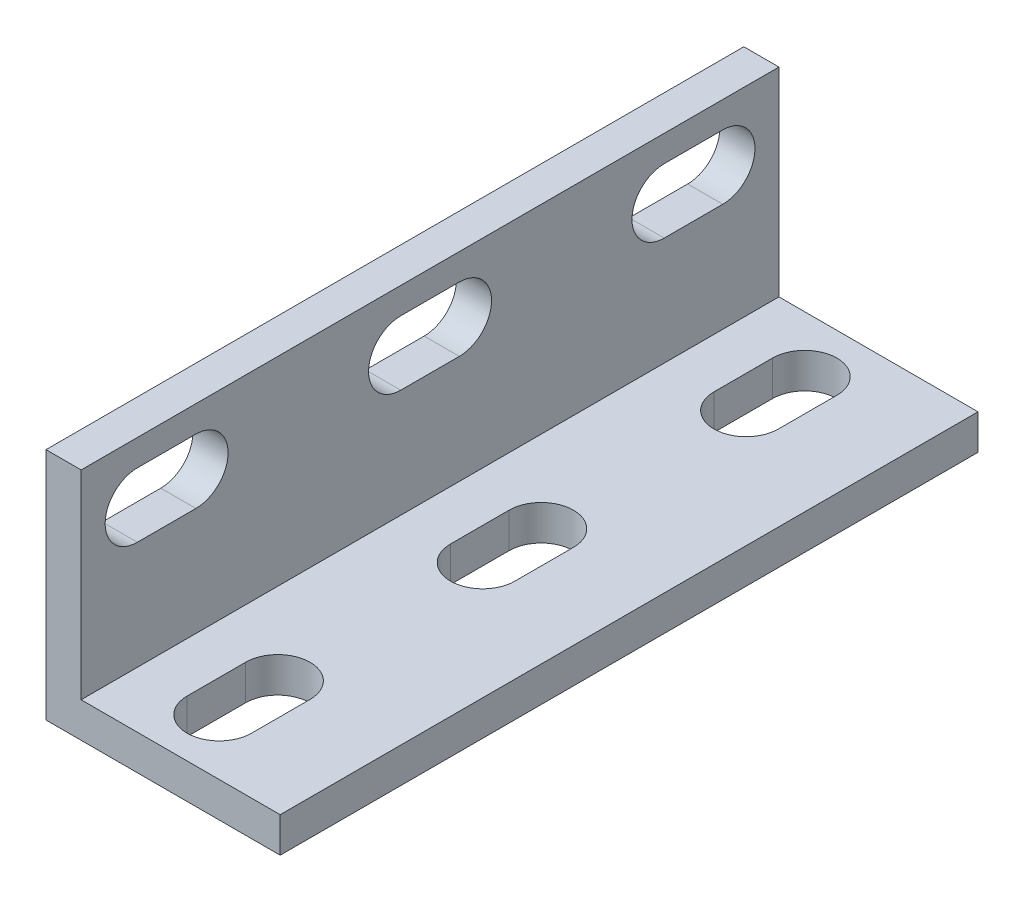
ISO-10303-21;
HEADER;
FILE_DESCRIPTION(('STEP AP214'),'2;1');
FILE_NAME('part.step','',(''),(''),'','','');
FILE_SCHEMA(('AUTOMOTIVE_DESIGN { 1 0 10303 214 1 1 1 1 }'));
ENDSEC;
DATA;
#1=APPLICATION_CONTEXT('core data for automotive mechanical design processes');
#2=APPLICATION_PROTOCOL_DEFINITION('international standard','automotive_design',2000,#1);
#3=PRODUCT_CONTEXT('',#1,'mechanical');
#4=PRODUCT('Part','Part','',(#3));
#5=PRODUCT_RELATED_PRODUCT_CATEGORY('part','',(#4));
#6=PRODUCT_DEFINITION_FORMATION('','',#4);
#7=PRODUCT_DEFINITION_CONTEXT('part definition',#1,'design');
#8=PRODUCT_DEFINITION('design','',#6,#7);
#9=PRODUCT_DEFINITION_SHAPE('','',#8);
#10=(LENGTH_UNIT() NAMED_UNIT(*) SI_UNIT(.MILLI.,.METRE.));
#11=(NAMED_UNIT(*) PLANE_ANGLE_UNIT() SI_UNIT($,.RADIAN.));
#12=(NAMED_UNIT(*) SI_UNIT($,.STERADIAN.) SOLID_ANGLE_UNIT());
#13=UNCERTAINTY_MEASURE_WITH_UNIT(LENGTH_MEASURE(1.E-05),#10,'distance_accuracy_value','');
#14=(GEOMETRIC_REPRESENTATION_CONTEXT(3) GLOBAL_UNCERTAINTY_ASSIGNED_CONTEXT((#13)) GLOBAL_UNIT_ASSIGNED_CONTEXT((#10,
#11,#12)) REPRESENTATION_CONTEXT('',''));
#15=CARTESIAN_POINT('',(0.,0.,0.));
#16=DIRECTION('',(0.,0.,1.));
#17=DIRECTION('',(1.,0.,0.));
#18=AXIS2_PLACEMENT_3D('',#15,#16,#17);
#19=CARTESIAN_POINT('',(0.,0.,59.6));
#20=DIRECTION('',(0.,1.,0.));
#21=DIRECTION('',(0.,0.,1.));
#22=AXIS2_PLACEMENT_3D('',#19,#20,#21);
#23=PLANE('',#22);
#24=DIRECTION('',(0.,0.,-1.));
#25=VECTOR('',#24,1.);
#26=CARTESIAN_POINT('',(12.75,0.,27.3));
#27=LINE('',#26,#25);
#28=CARTESIAN_POINT('',(12.75,0.,32.3));
#29=VERTEX_POINT('',#28);
#30=CARTESIAN_POINT('',(12.75,0.,27.3));
#31=VERTEX_POINT('',#30);
#32=EDGE_CURVE('E339',#29,#31,#27,.T.);
#33=ORIENTED_EDGE('',*,*,#32,.T.);
#34=CARTESIAN_POINT('',(10.,0.,27.3));
#35=DIRECTION('',(0.,1.,0.));
#36=DIRECTION('',(0.,0.,1.));
#37=AXIS2_PLACEMENT_3D('',#34,#35,#36);
#38=CIRCLE('',#37,2.75);
#39=CARTESIAN_POINT('',(7.25,0.,27.3));
#40=VERTEX_POINT('',#39);
#41=EDGE_CURVE('E329',#31,#40,#38,.T.);
#42=ORIENTED_EDGE('',*,*,#41,.T.);
#43=DIRECTION('',(0.,0.,1.));
#44=VECTOR('',#43,1.);
#45=CARTESIAN_POINT('',(7.25,0.,27.3));
#46=LINE('',#45,#44);
#47=CARTESIAN_POINT('',(7.25,0.,32.3));
#48=VERTEX_POINT('',#47);
#49=EDGE_CURVE('E332',#40,#48,#46,.T.);
#50=ORIENTED_EDGE('',*,*,#49,.T.);
#51=CARTESIAN_POINT('',(10.,0.,32.3));
#52=DIRECTION('',(0.,1.,0.));
#53=DIRECTION('',(0.,0.,1.));
#54=AXIS2_PLACEMENT_3D('',#51,#52,#53);
#55=CIRCLE('',#54,2.75);
#56=EDGE_CURVE('E336',#48,#29,#55,.T.);
#57=ORIENTED_EDGE('',*,*,#56,.T.);
#58=EDGE_LOOP('',(#33,#42,#50,#57));
#59=FACE_BOUND('',#58,.T.);
#60=DIRECTION('',(0.,0.,1.));
#61=VECTOR('',#60,1.);
#62=CARTESIAN_POINT('',(7.25,0.,9.8));
#63=LINE('',#62,#61);
#64=CARTESIAN_POINT('',(7.25,0.,4.8));
#65=VERTEX_POINT('',#64);
#66=CARTESIAN_POINT('',(7.25,0.,9.8));
#67=VERTEX_POINT('',#66);
#68=EDGE_CURVE('E373',#65,#67,#63,.T.);
#69=ORIENTED_EDGE('',*,*,#68,.T.);
#70=CARTESIAN_POINT('',(10.,0.,9.8));
#71=DIRECTION('',(0.,1.,0.));
#72=DIRECTION('',(0.,0.,1.));
#73=AXIS2_PLACEMENT_3D('',#70,#71,#72);
#74=CIRCLE('',#73,2.75);
#75=CARTESIAN_POINT('',(12.75,0.,9.8));
#76=VERTEX_POINT('',#75);
#77=EDGE_CURVE('E363',#67,#76,#74,.T.);
#78=ORIENTED_EDGE('',*,*,#77,.T.);
#79=DIRECTION('',(0.,0.,-1.));
#80=VECTOR('',#79,1.);
#81=CARTESIAN_POINT('',(12.75,0.,9.8));
#82=LINE('',#81,#80);
#83=CARTESIAN_POINT('',(12.75,0.,4.8));
#84=VERTEX_POINT('',#83);
#85=EDGE_CURVE('E366',#76,#84,#82,.T.);
#86=ORIENTED_EDGE('',*,*,#85,.T.);
#87=CARTESIAN_POINT('',(10.,0.,4.8));
#88=DIRECTION('',(0.,1.,0.));
#89=DIRECTION('',(0.,0.,1.));
#90=AXIS2_PLACEMENT_3D('',#87,#88,#89);
#91=CIRCLE('',#90,2.75);
#92=EDGE_CURVE('E370',#84,#65,#91,.T.);
#93=ORIENTED_EDGE('',*,*,#92,.T.);
#94=EDGE_LOOP('',(#69,#78,#86,#93));
#95=FACE_BOUND('',#94,.T.);
#96=DIRECTION('',(0.,0.,1.));
#97=VECTOR('',#96,1.);
#98=CARTESIAN_POINT('',(7.25,0.,54.8));
#99=LINE('',#98,#97);
#100=CARTESIAN_POINT('',(7.25,0.,49.8));
#101=VERTEX_POINT('',#100);
#102=CARTESIAN_POINT('',(7.25,0.,54.8));
#103=VERTEX_POINT('',#102);
#104=EDGE_CURVE('E403',#101,#103,#99,.T.);
#105=ORIENTED_EDGE('',*,*,#104,.T.);
#106=CARTESIAN_POINT('',(10.,0.,54.8));
#107=DIRECTION('',(0.,1.,0.));
#108=DIRECTION('',(0.,0.,1.));
#109=AXIS2_PLACEMENT_3D('',#106,#107,#108);
#110=CIRCLE('',#109,2.75);
#111=CARTESIAN_POINT('',(12.75,0.,54.8));
#112=VERTEX_POINT('',#111);
#113=EDGE_CURVE('E393',#103,#112,#110,.T.);
#114=ORIENTED_EDGE('',*,*,#113,.T.);
#115=DIRECTION('',(0.,0.,-1.));
#116=VECTOR('',#115,1.);
#117=CARTESIAN_POINT('',(12.75,0.,54.8));
#118=LINE('',#117,#116);
#119=CARTESIAN_POINT('',(12.75,0.,49.8));
#120=VERTEX_POINT('',#119);
#121=EDGE_CURVE('E396',#112,#120,#118,.T.);
#122=ORIENTED_EDGE('',*,*,#121,.T.);
#123=CARTESIAN_POINT('',(10.,0.,49.8));
#124=DIRECTION('',(0.,1.,0.));
#125=DIRECTION('',(0.,0.,1.));
#126=AXIS2_PLACEMENT_3D('',#123,#124,#125);
#127=CIRCLE('',#126,2.75);
#128=EDGE_CURVE('E400',#120,#101,#127,.T.);
#129=ORIENTED_EDGE('',*,*,#128,.T.);
#130=EDGE_LOOP('',(#105,#114,#122,#129));
#131=FACE_BOUND('',#130,.T.);
#132=DIRECTION('',(1.,0.,0.));
#133=VECTOR('',#132,1.);
#134=CARTESIAN_POINT('',(0.,0.,0.));
#135=LINE('',#134,#133);
#136=CARTESIAN_POINT('',(0.,0.,0.));
#137=VERTEX_POINT('',#136);
#138=CARTESIAN_POINT('',(20.,0.,0.));
#139=VERTEX_POINT('',#138);
#140=EDGE_CURVE('E418',#137,#139,#135,.T.);
#141=ORIENTED_EDGE('',*,*,#140,.T.);
#142=DIRECTION('',(0.,0.,-1.));
#143=VECTOR('',#142,1.);
#144=CARTESIAN_POINT('',(20.,0.,59.6));
#145=LINE('',#144,#143);
#146=CARTESIAN_POINT('',(20.,0.,59.6));
#147=VERTEX_POINT('',#146);
#148=EDGE_CURVE('E11',#147,#139,#145,.T.);
#149=ORIENTED_EDGE('',*,*,#148,.F.);
#150=DIRECTION('',(1.,0.,0.));
#151=VECTOR('',#150,1.);
#152=CARTESIAN_POINT('',(0.,0.,59.6));
#153=LINE('',#152,#151);
#154=CARTESIAN_POINT('',(0.,0.,59.6));
#155=VERTEX_POINT('',#154);
#156=EDGE_CURVE('E425',#155,#147,#153,.T.);
#157=ORIENTED_EDGE('',*,*,#156,.F.);
#158=DIRECTION('',(0.,0.,-1.));
#159=VECTOR('',#158,1.);
#160=CARTESIAN_POINT('',(0.,0.,59.6));
#161=LINE('',#160,#159);
#162=EDGE_CURVE('E442',#155,#137,#161,.T.);
#163=ORIENTED_EDGE('',*,*,#162,.T.);
#164=EDGE_LOOP('',(#141,#149,#157,#163));
#165=FACE_BOUND('',#164,.T.);
#166=ADVANCED_FACE('F32',(#59,#95,#131,#165),#23,.F.);
#167=CARTESIAN_POINT('',(20.,3.,59.6));
#168=DIRECTION('',(1.,0.,0.));
#169=DIRECTION('',(0.,0.,-1.));
#170=AXIS2_PLACEMENT_3D('',#167,#168,#169);
#171=PLANE('',#170);
#172=DIRECTION('',(0.,-1.,0.));
#173=VECTOR('',#172,1.);
#174=CARTESIAN_POINT('',(20.,3.,0.));
#175=LINE('',#174,#173);
#176=CARTESIAN_POINT('',(20.,3.,0.));
#177=VERTEX_POINT('',#176);
#178=EDGE_CURVE('E445',#177,#139,#175,.T.);
#179=ORIENTED_EDGE('',*,*,#178,.F.);
#180=DIRECTION('',(0.,0.,-1.));
#181=VECTOR('',#180,1.);
#182=CARTESIAN_POINT('',(20.,3.,59.6));
#183=LINE('',#182,#181);
#184=CARTESIAN_POINT('',(20.,3.,59.6));
#185=VERTEX_POINT('',#184);
#186=EDGE_CURVE('E39',#185,#177,#183,.T.);
#187=ORIENTED_EDGE('',*,*,#186,.F.);
#188=DIRECTION('',(0.,-1.,0.));
#189=VECTOR('',#188,1.);
#190=CARTESIAN_POINT('',(20.,3.,59.6));
#191=LINE('',#190,#189);
#192=EDGE_CURVE('E427',#185,#147,#191,.T.);
#193=ORIENTED_EDGE('',*,*,#192,.T.);
#194=ORIENTED_EDGE('',*,*,#148,.T.);
#195=EDGE_LOOP('',(#179,#187,#193,#194));
#196=FACE_BOUND('',#195,.T.);
#197=ADVANCED_FACE('F472',(#196),#171,.T.);
#198=CARTESIAN_POINT('',(0.,3.,59.6));
#199=DIRECTION('',(0.,1.,0.));
#200=DIRECTION('',(0.,0.,1.));
#201=AXIS2_PLACEMENT_3D('',#198,#199,#200);
#202=PLANE('',#201);
#203=CARTESIAN_POINT('',(10.,3.,27.3));
#204=DIRECTION('',(0.,1.,0.));
#205=DIRECTION('',(0.,0.,1.));
#206=AXIS2_PLACEMENT_3D('',#203,#204,#205);
#207=CIRCLE('',#206,2.75);
#208=CARTESIAN_POINT('',(12.75,3.,27.3));
#209=VERTEX_POINT('',#208);
#210=CARTESIAN_POINT('',(7.25,3.,27.3));
#211=VERTEX_POINT('',#210);
#212=EDGE_CURVE('E343',#209,#211,#207,.T.);
#213=ORIENTED_EDGE('',*,*,#212,.F.);
#214=DIRECTION('',(0.,0.,-1.));
#215=VECTOR('',#214,1.);
#216=CARTESIAN_POINT('',(12.75,3.,27.3));
#217=LINE('',#216,#215);
#218=CARTESIAN_POINT('',(12.75,3.,32.3));
#219=VERTEX_POINT('',#218);
#220=EDGE_CURVE('E333',#219,#209,#217,.T.);
#221=ORIENTED_EDGE('',*,*,#220,.F.);
#222=CARTESIAN_POINT('',(10.,3.,32.3));
#223=DIRECTION('',(0.,1.,0.));
#224=DIRECTION('',(0.,0.,1.));
#225=AXIS2_PLACEMENT_3D('',#222,#223,#224);
#226=CIRCLE('',#225,2.75);
#227=CARTESIAN_POINT('',(7.25,3.,32.3));
#228=VERTEX_POINT('',#227);
#229=EDGE_CURVE('E349',#228,#219,#226,.T.);
#230=ORIENTED_EDGE('',*,*,#229,.F.);
#231=DIRECTION('',(0.,0.,1.));
#232=VECTOR('',#231,1.);
#233=CARTESIAN_POINT('',(7.25,3.,27.3));
#234=LINE('',#233,#232);
#235=EDGE_CURVE('E345',#211,#228,#234,.T.);
#236=ORIENTED_EDGE('',*,*,#235,.F.);
#237=EDGE_LOOP('',(#213,#221,#230,#236));
#238=FACE_BOUND('',#237,.T.);
#239=CARTESIAN_POINT('',(10.,3.,9.8));
#240=DIRECTION('',(0.,1.,0.));
#241=DIRECTION('',(0.,0.,1.));
#242=AXIS2_PLACEMENT_3D('',#239,#240,#241);
#243=CIRCLE('',#242,2.75);
#244=CARTESIAN_POINT('',(7.25,3.,9.8));
#245=VERTEX_POINT('',#244);
#246=CARTESIAN_POINT('',(12.75,3.,9.8));
#247=VERTEX_POINT('',#246);
#248=EDGE_CURVE('E322',#245,#247,#243,.T.);
#249=ORIENTED_EDGE('',*,*,#248,.F.);
#250=DIRECTION('',(0.,0.,1.));
#251=VECTOR('',#250,1.);
#252=CARTESIAN_POINT('',(7.25,3.,9.8));
#253=LINE('',#252,#251);
#254=CARTESIAN_POINT('',(7.25,3.,4.8));
#255=VERTEX_POINT('',#254);
#256=EDGE_CURVE('E367',#255,#245,#253,.T.);
#257=ORIENTED_EDGE('',*,*,#256,.F.);
#258=CARTESIAN_POINT('',(10.,3.,4.8));
#259=DIRECTION('',(0.,1.,0.));
#260=DIRECTION('',(0.,0.,1.));
#261=AXIS2_PLACEMENT_3D('',#258,#259,#260);
#262=CIRCLE('',#261,2.75);
#263=CARTESIAN_POINT('',(12.75,3.,4.8));
#264=VERTEX_POINT('',#263);
#265=EDGE_CURVE('E381',#264,#255,#262,.T.);
#266=ORIENTED_EDGE('',*,*,#265,.F.);
#267=DIRECTION('',(0.,0.,-1.));
#268=VECTOR('',#267,1.);
#269=CARTESIAN_POINT('',(12.75,3.,9.8));
#270=LINE('',#269,#268);
#271=EDGE_CURVE('E378',#247,#264,#270,.T.);
#272=ORIENTED_EDGE('',*,*,#271,.F.);
#273=EDGE_LOOP('',(#249,#257,#266,#272));
#274=FACE_BOUND('',#273,.T.);
#275=CARTESIAN_POINT('',(10.,3.,54.8));
#276=DIRECTION('',(0.,1.,0.));
#277=DIRECTION('',(0.,0.,1.));
#278=AXIS2_PLACEMENT_3D('',#275,#276,#277);
#279=CIRCLE('',#278,2.75);
#280=CARTESIAN_POINT('',(7.25,3.,54.8));
#281=VERTEX_POINT('',#280);
#282=CARTESIAN_POINT('',(12.75,3.,54.8));
#283=VERTEX_POINT('',#282);
#284=EDGE_CURVE('E356',#281,#283,#279,.T.);
#285=ORIENTED_EDGE('',*,*,#284,.F.);
#286=DIRECTION('',(0.,0.,1.));
#287=VECTOR('',#286,1.);
#288=CARTESIAN_POINT('',(7.25,3.,54.8));
#289=LINE('',#288,#287);
#290=CARTESIAN_POINT('',(7.25,3.,49.8));
#291=VERTEX_POINT('',#290);
#292=EDGE_CURVE('E397',#291,#281,#289,.T.);
#293=ORIENTED_EDGE('',*,*,#292,.F.);
#294=CARTESIAN_POINT('',(10.,3.,49.8));
#295=DIRECTION('',(0.,1.,0.));
#296=DIRECTION('',(0.,0.,1.));
#297=AXIS2_PLACEMENT_3D('',#294,#295,#296);
#298=CIRCLE('',#297,2.75);
#299=CARTESIAN_POINT('',(12.75,3.,49.8));
#300=VERTEX_POINT('',#299);
#301=EDGE_CURVE('E411',#300,#291,#298,.T.);
#302=ORIENTED_EDGE('',*,*,#301,.F.);
#303=DIRECTION('',(0.,0.,-1.));
#304=VECTOR('',#303,1.);
#305=CARTESIAN_POINT('',(12.75,3.,54.8));
#306=LINE('',#305,#304);
#307=EDGE_CURVE('E408',#283,#300,#306,.T.);
#308=ORIENTED_EDGE('',*,*,#307,.F.);
#309=EDGE_LOOP('',(#285,#293,#302,#308));
#310=FACE_BOUND('',#309,.T.);
#311=DIRECTION('',(1.,0.,0.));
#312=VECTOR('',#311,1.);
#313=CARTESIAN_POINT('',(0.,3.,0.));
#314=LINE('',#313,#312);
#315=CARTESIAN_POINT('',(3.,3.,0.));
#316=VERTEX_POINT('',#315);
#317=EDGE_CURVE('E448',#316,#177,#314,.T.);
#318=ORIENTED_EDGE('',*,*,#317,.F.);
#319=DIRECTION('',(0.,0.,-1.));
#320=VECTOR('',#319,1.);
#321=CARTESIAN_POINT('',(3.,3.,59.6));
#322=LINE('',#321,#320);
#323=CARTESIAN_POINT('',(3.,3.,59.6));
#324=VERTEX_POINT('',#323);
#325=EDGE_CURVE('E464',#324,#316,#322,.T.);
#326=ORIENTED_EDGE('',*,*,#325,.F.);
#327=DIRECTION('',(1.,0.,0.));
#328=VECTOR('',#327,1.);
#329=CARTESIAN_POINT('',(0.,3.,59.6));
#330=LINE('',#329,#328);
#331=EDGE_CURVE('E431',#324,#185,#330,.T.);
#332=ORIENTED_EDGE('',*,*,#331,.T.);
#333=ORIENTED_EDGE('',*,*,#186,.T.);
#334=EDGE_LOOP('',(#318,#326,#332,#333));
#335=FACE_BOUND('',#334,.T.);
#336=ADVANCED_FACE('F468',(#238,#274,#310,#335),#202,.T.);
#337=CARTESIAN_POINT('',(3.,20.,59.6));
#338=DIRECTION('',(1.,0.,0.));
#339=DIRECTION('',(0.,1.,0.));
#340=AXIS2_PLACEMENT_3D('',#337,#338,#339);
#341=PLANE('',#340);
#342=CARTESIAN_POINT('',(3.,15.,32.3));
#343=DIRECTION('',(1.,0.,0.));
#344=DIRECTION('',(0.,1.,0.));
#345=AXIS2_PLACEMENT_3D('',#342,#343,#344);
#346=CIRCLE('',#345,2.75);
#347=CARTESIAN_POINT('',(3.,17.75,32.3));
#348=VERTEX_POINT('',#347);
#349=CARTESIAN_POINT('',(3.,12.25,32.3));
#350=VERTEX_POINT('',#349);
#351=EDGE_CURVE('E46',#348,#350,#346,.T.);
#352=ORIENTED_EDGE('',*,*,#351,.F.);
#353=DIRECTION('',(0.,0.,1.));
#354=VECTOR('',#353,1.);
#355=CARTESIAN_POINT('',(3.,17.75,32.3));
#356=LINE('',#355,#354);
#357=CARTESIAN_POINT('',(3.,17.75,27.3));
#358=VERTEX_POINT('',#357);
#359=EDGE_CURVE('E248',#358,#348,#356,.T.);
#360=ORIENTED_EDGE('',*,*,#359,.F.);
#361=CARTESIAN_POINT('',(3.,15.,27.3));
#362=DIRECTION('',(1.,0.,0.));
#363=DIRECTION('',(0.,1.,0.));
#364=AXIS2_PLACEMENT_3D('',#361,#362,#363);
#365=CIRCLE('',#364,2.75);
#366=CARTESIAN_POINT('',(3.,12.25,27.3));
#367=VERTEX_POINT('',#366);
#368=EDGE_CURVE('E251',#367,#358,#365,.T.);
#369=ORIENTED_EDGE('',*,*,#368,.F.);
#370=DIRECTION('',(0.,0.,-1.));
#371=VECTOR('',#370,1.);
#372=CARTESIAN_POINT('',(3.,12.25,32.3));
#373=LINE('',#372,#371);
#374=EDGE_CURVE('E257',#350,#367,#373,.T.);
#375=ORIENTED_EDGE('',*,*,#374,.F.);
#376=EDGE_LOOP('',(#352,#360,#369,#375));
#377=FACE_BOUND('',#376,.T.);
#378=CARTESIAN_POINT('',(3.,15.,9.79999999999999));
#379=DIRECTION('',(1.,0.,0.));
#380=DIRECTION('',(0.,1.,0.));
#381=AXIS2_PLACEMENT_3D('',#378,#379,#380);
#382=CIRCLE('',#381,2.75);
#383=CARTESIAN_POINT('',(3.,17.75,9.79999999999999));
#384=VERTEX_POINT('',#383);
#385=CARTESIAN_POINT('',(3.,12.25,9.79999999999999));
#386=VERTEX_POINT('',#385);
#387=EDGE_CURVE('E54',#384,#386,#382,.T.);
#388=ORIENTED_EDGE('',*,*,#387,.F.);
#389=DIRECTION('',(0.,0.,1.));
#390=VECTOR('',#389,1.);
#391=CARTESIAN_POINT('',(3.,17.75,9.79999999999999));
#392=LINE('',#391,#390);
#393=CARTESIAN_POINT('',(3.,17.75,4.79999999999998));
#394=VERTEX_POINT('',#393);
#395=EDGE_CURVE('E272',#394,#384,#392,.T.);
#396=ORIENTED_EDGE('',*,*,#395,.F.);
#397=CARTESIAN_POINT('',(3.,15.,4.79999999999998));
#398=DIRECTION('',(1.,0.,0.));
#399=DIRECTION('',(0.,1.,0.));
#400=AXIS2_PLACEMENT_3D('',#397,#398,#399);
#401=CIRCLE('',#400,2.75);
#402=CARTESIAN_POINT('',(3.,12.25,4.79999999999998));
#403=VERTEX_POINT('',#402);
#404=EDGE_CURVE('E286',#403,#394,#401,.T.);
#405=ORIENTED_EDGE('',*,*,#404,.F.);
#406=DIRECTION('',(0.,0.,-1.));
#407=VECTOR('',#406,1.);
#408=CARTESIAN_POINT('',(3.,12.25,9.79999999999999));
#409=LINE('',#408,#407);
#410=EDGE_CURVE('E283',#386,#403,#409,.T.);
#411=ORIENTED_EDGE('',*,*,#410,.F.);
#412=EDGE_LOOP('',(#388,#396,#405,#411));
#413=FACE_BOUND('',#412,.T.);
#414=CARTESIAN_POINT('',(3.,15.,54.8));
#415=DIRECTION('',(1.,0.,0.));
#416=DIRECTION('',(0.,1.,0.));
#417=AXIS2_PLACEMENT_3D('',#414,#415,#416);
#418=CIRCLE('',#417,2.75);
#419=CARTESIAN_POINT('',(3.,17.75,54.8));
#420=VERTEX_POINT('',#419);
#421=CARTESIAN_POINT('',(3.,12.25,54.8));
#422=VERTEX_POINT('',#421);
#423=EDGE_CURVE('E264',#420,#422,#418,.T.);
#424=ORIENTED_EDGE('',*,*,#423,.F.);
#425=DIRECTION('',(0.,0.,1.));
#426=VECTOR('',#425,1.);
#427=CARTESIAN_POINT('',(3.,17.75,54.8));
#428=LINE('',#427,#426);
#429=CARTESIAN_POINT('',(3.,17.75,49.8));
#430=VERTEX_POINT('',#429);
#431=EDGE_CURVE('E301',#430,#420,#428,.T.);
#432=ORIENTED_EDGE('',*,*,#431,.F.);
#433=CARTESIAN_POINT('',(3.,15.,49.8));
#434=DIRECTION('',(1.,0.,0.));
#435=DIRECTION('',(0.,1.,0.));
#436=AXIS2_PLACEMENT_3D('',#433,#434,#435);
#437=CIRCLE('',#436,2.75);
#438=CARTESIAN_POINT('',(3.,12.25,49.8));
#439=VERTEX_POINT('',#438);
#440=EDGE_CURVE('E315',#439,#430,#437,.T.);
#441=ORIENTED_EDGE('',*,*,#440,.F.);
#442=DIRECTION('',(0.,0.,-1.));
#443=VECTOR('',#442,1.);
#444=CARTESIAN_POINT('',(3.,12.25,54.8));
#445=LINE('',#444,#443);
#446=EDGE_CURVE('E312',#422,#439,#445,.T.);
#447=ORIENTED_EDGE('',*,*,#446,.F.);
#448=EDGE_LOOP('',(#424,#432,#441,#447));
#449=FACE_BOUND('',#448,.T.);
#450=DIRECTION('',(0.,-1.,0.));
#451=VECTOR('',#450,1.);
#452=CARTESIAN_POINT('',(3.,20.,0.));
#453=LINE('',#452,#451);
#454=CARTESIAN_POINT('',(3.,20.,0.));
#455=VERTEX_POINT('',#454);
#456=EDGE_CURVE('E451',#455,#316,#453,.T.);
#457=ORIENTED_EDGE('',*,*,#456,.F.);
#458=DIRECTION('',(0.,0.,-1.));
#459=VECTOR('',#458,1.);
#460=CARTESIAN_POINT('',(3.,20.,59.6));
#461=LINE('',#460,#459);
#462=CARTESIAN_POINT('',(3.,20.,59.6));
#463=VERTEX_POINT('',#462);
#464=EDGE_CURVE('E462',#463,#455,#461,.T.);
#465=ORIENTED_EDGE('',*,*,#464,.F.);
#466=DIRECTION('',(0.,-1.,0.));
#467=VECTOR('',#466,1.);
#468=CARTESIAN_POINT('',(3.,20.,59.6));
#469=LINE('',#468,#467);
#470=EDGE_CURVE('E434',#463,#324,#469,.T.);
#471=ORIENTED_EDGE('',*,*,#470,.T.);
#472=ORIENTED_EDGE('',*,*,#325,.T.);
#473=EDGE_LOOP('',(#457,#465,#471,#472));
#474=FACE_BOUND('',#473,.T.);
#475=ADVANCED_FACE('F481',(#377,#413,#449,#474),#341,.T.);
#476=CARTESIAN_POINT('',(0.,20.,59.6));
#477=DIRECTION('',(0.,1.,0.));
#478=DIRECTION('',(0.,0.,1.));
#479=AXIS2_PLACEMENT_3D('',#476,#477,#478);
#480=PLANE('',#479);
#481=DIRECTION('',(1.,0.,0.));
#482=VECTOR('',#481,1.);
#483=CARTESIAN_POINT('',(0.,20.,0.));
#484=LINE('',#483,#482);
#485=CARTESIAN_POINT('',(0.,20.,0.));
#486=VERTEX_POINT('',#485);
#487=EDGE_CURVE('E454',#486,#455,#484,.T.);
#488=ORIENTED_EDGE('',*,*,#487,.F.);
#489=DIRECTION('',(0.,0.,-1.));
#490=VECTOR('',#489,1.);
#491=CARTESIAN_POINT('',(0.,20.,59.6));
#492=LINE('',#491,#490);
#493=CARTESIAN_POINT('',(0.,20.,59.6));
#494=VERTEX_POINT('',#493);
#495=EDGE_CURVE('E460',#494,#486,#492,.T.);
#496=ORIENTED_EDGE('',*,*,#495,.F.);
#497=DIRECTION('',(1.,0.,0.));
#498=VECTOR('',#497,1.);
#499=CARTESIAN_POINT('',(0.,20.,59.6));
#500=LINE('',#499,#498);
#501=EDGE_CURVE('E437',#494,#463,#500,.T.);
#502=ORIENTED_EDGE('',*,*,#501,.T.);
#503=ORIENTED_EDGE('',*,*,#464,.T.);
#504=EDGE_LOOP('',(#488,#496,#502,#503));
#505=FACE_BOUND('',#504,.T.);
#506=ADVANCED_FACE('F492',(#505),#480,.T.);
#507=CARTESIAN_POINT('',(0.,20.,59.6));
#508=DIRECTION('',(1.,0.,0.));
#509=DIRECTION('',(0.,1.,0.));
#510=AXIS2_PLACEMENT_3D('',#507,#508,#509);
#511=PLANE('',#510);
#512=DIRECTION('',(0.,0.,1.));
#513=VECTOR('',#512,1.);
#514=CARTESIAN_POINT('',(0.,17.75,32.3));
#515=LINE('',#514,#513);
#516=CARTESIAN_POINT('',(0.,17.75,27.3));
#517=VERTEX_POINT('',#516);
#518=CARTESIAN_POINT('',(0.,17.75,32.3));
#519=VERTEX_POINT('',#518);
#520=EDGE_CURVE('E235',#517,#519,#515,.T.);
#521=ORIENTED_EDGE('',*,*,#520,.T.);
#522=CARTESIAN_POINT('',(0.,15.,32.3));
#523=DIRECTION('',(1.,0.,0.));
#524=DIRECTION('',(0.,1.,0.));
#525=AXIS2_PLACEMENT_3D('',#522,#523,#524);
#526=CIRCLE('',#525,2.75);
#527=CARTESIAN_POINT('',(0.,12.25,32.3));
#528=VERTEX_POINT('',#527);
#529=EDGE_CURVE('E229',#519,#528,#526,.T.);
#530=ORIENTED_EDGE('',*,*,#529,.T.);
#531=DIRECTION('',(0.,0.,-1.));
#532=VECTOR('',#531,1.);
#533=CARTESIAN_POINT('',(0.,12.25,32.3));
#534=LINE('',#533,#532);
#535=CARTESIAN_POINT('',(0.,12.25,27.3));
#536=VERTEX_POINT('',#535);
#537=EDGE_CURVE('E239',#528,#536,#534,.T.);
#538=ORIENTED_EDGE('',*,*,#537,.T.);
#539=CARTESIAN_POINT('',(0.,15.,27.3));
#540=DIRECTION('',(1.,0.,0.));
#541=DIRECTION('',(0.,1.,0.));
#542=AXIS2_PLACEMENT_3D('',#539,#540,#541);
#543=CIRCLE('',#542,2.75);
#544=EDGE_CURVE('E243',#536,#517,#543,.T.);
#545=ORIENTED_EDGE('',*,*,#544,.T.);
#546=EDGE_LOOP('',(#521,#530,#538,#545));
#547=FACE_BOUND('',#546,.T.);
#548=DIRECTION('',(0.,0.,1.));
#549=VECTOR('',#548,1.);
#550=CARTESIAN_POINT('',(0.,17.75,9.79999999999999));
#551=LINE('',#550,#549);
#552=CARTESIAN_POINT('',(0.,17.75,4.79999999999998));
#553=VERTEX_POINT('',#552);
#554=CARTESIAN_POINT('',(0.,17.75,9.79999999999999));
#555=VERTEX_POINT('',#554);
#556=EDGE_CURVE('E278',#553,#555,#551,.T.);
#557=ORIENTED_EDGE('',*,*,#556,.T.);
#558=CARTESIAN_POINT('',(0.,15.,9.79999999999999));
#559=DIRECTION('',(1.,0.,0.));
#560=DIRECTION('',(0.,1.,0.));
#561=AXIS2_PLACEMENT_3D('',#558,#559,#560);
#562=CIRCLE('',#561,2.75);
#563=CARTESIAN_POINT('',(0.,12.25,9.79999999999999));
#564=VERTEX_POINT('',#563);
#565=EDGE_CURVE('E268',#555,#564,#562,.T.);
#566=ORIENTED_EDGE('',*,*,#565,.T.);
#567=DIRECTION('',(0.,0.,-1.));
#568=VECTOR('',#567,1.);
#569=CARTESIAN_POINT('',(0.,12.25,9.79999999999999));
#570=LINE('',#569,#568);
#571=CARTESIAN_POINT('',(0.,12.25,4.79999999999998));
#572=VERTEX_POINT('',#571);
#573=EDGE_CURVE('E271',#564,#572,#570,.T.);
#574=ORIENTED_EDGE('',*,*,#573,.T.);
#575=CARTESIAN_POINT('',(0.,15.,4.79999999999998));
#576=DIRECTION('',(1.,0.,0.));
#577=DIRECTION('',(0.,1.,0.));
#578=AXIS2_PLACEMENT_3D('',#575,#576,#577);
#579=CIRCLE('',#578,2.75);
#580=EDGE_CURVE('E275',#572,#553,#579,.T.);
#581=ORIENTED_EDGE('',*,*,#580,.T.);
#582=EDGE_LOOP('',(#557,#566,#574,#581));
#583=FACE_BOUND('',#582,.T.);
#584=DIRECTION('',(0.,0.,1.));
#585=VECTOR('',#584,1.);
#586=CARTESIAN_POINT('',(0.,17.75,54.8));
#587=LINE('',#586,#585);
#588=CARTESIAN_POINT('',(0.,17.75,49.8));
#589=VERTEX_POINT('',#588);
#590=CARTESIAN_POINT('',(0.,17.75,54.8));
#591=VERTEX_POINT('',#590);
#592=EDGE_CURVE('E307',#589,#591,#587,.T.);
#593=ORIENTED_EDGE('',*,*,#592,.T.);
#594=CARTESIAN_POINT('',(0.,15.,54.8));
#595=DIRECTION('',(1.,0.,0.));
#596=DIRECTION('',(0.,1.,0.));
#597=AXIS2_PLACEMENT_3D('',#594,#595,#596);
#598=CIRCLE('',#597,2.75);
#599=CARTESIAN_POINT('',(0.,12.25,54.8));
#600=VERTEX_POINT('',#599);
#601=EDGE_CURVE('E297',#591,#600,#598,.T.);
#602=ORIENTED_EDGE('',*,*,#601,.T.);
#603=DIRECTION('',(0.,0.,-1.));
#604=VECTOR('',#603,1.);
#605=CARTESIAN_POINT('',(0.,12.25,54.8));
#606=LINE('',#605,#604);
#607=CARTESIAN_POINT('',(0.,12.25,49.8));
#608=VERTEX_POINT('',#607);
#609=EDGE_CURVE('E300',#600,#608,#606,.T.);
#610=ORIENTED_EDGE('',*,*,#609,.T.);
#611=CARTESIAN_POINT('',(0.,15.,49.8));
#612=DIRECTION('',(1.,0.,0.));
#613=DIRECTION('',(0.,1.,0.));
#614=AXIS2_PLACEMENT_3D('',#611,#612,#613);
#615=CIRCLE('',#614,2.75);
#616=EDGE_CURVE('E304',#608,#589,#615,.T.);
#617=ORIENTED_EDGE('',*,*,#616,.T.);
#618=EDGE_LOOP('',(#593,#602,#610,#617));
#619=FACE_BOUND('',#618,.T.);
#620=DIRECTION('',(0.,-1.,0.));
#621=VECTOR('',#620,1.);
#622=CARTESIAN_POINT('',(0.,20.,0.));
#623=LINE('',#622,#621);
#624=EDGE_CURVE('E428',#486,#137,#623,.T.);
#625=ORIENTED_EDGE('',*,*,#624,.T.);
#626=ORIENTED_EDGE('',*,*,#162,.F.);
#627=DIRECTION('',(0.,-1.,0.));
#628=VECTOR('',#627,1.);
#629=CARTESIAN_POINT('',(0.,20.,59.6));
#630=LINE('',#629,#628);
#631=EDGE_CURVE('E440',#494,#155,#630,.T.);
#632=ORIENTED_EDGE('',*,*,#631,.F.);
#633=ORIENTED_EDGE('',*,*,#495,.T.);
#634=EDGE_LOOP('',(#625,#626,#632,#633));
#635=FACE_BOUND('',#634,.T.);
#636=ADVANCED_FACE('F245',(#547,#583,#619,#635),#511,.F.);
#637=CARTESIAN_POINT('',(0.,0.,59.6));
#638=DIRECTION('',(0.,0.,-1.));
#639=DIRECTION('',(-1.,0.,0.));
#640=AXIS2_PLACEMENT_3D('',#637,#638,#639);
#641=PLANE('',#640);
#642=ORIENTED_EDGE('',*,*,#156,.T.);
#643=ORIENTED_EDGE('',*,*,#192,.F.);
#644=ORIENTED_EDGE('',*,*,#331,.F.);
#645=ORIENTED_EDGE('',*,*,#470,.F.);
#646=ORIENTED_EDGE('',*,*,#501,.F.);
#647=ORIENTED_EDGE('',*,*,#631,.T.);
#648=EDGE_LOOP('',(#642,#643,#644,#645,#646,#647));
#649=FACE_BOUND('',#648,.T.);
#650=ADVANCED_FACE('F484',(#649),#641,.F.);
#651=CARTESIAN_POINT('',(0.,0.,0.));
#652=DIRECTION('',(0.,0.,-1.));
#653=DIRECTION('',(-1.,0.,0.));
#654=AXIS2_PLACEMENT_3D('',#651,#652,#653);
#655=PLANE('',#654);
#656=ORIENTED_EDGE('',*,*,#140,.F.);
#657=ORIENTED_EDGE('',*,*,#624,.F.);
#658=ORIENTED_EDGE('',*,*,#487,.T.);
#659=ORIENTED_EDGE('',*,*,#456,.T.);
#660=ORIENTED_EDGE('',*,*,#317,.T.);
#661=ORIENTED_EDGE('',*,*,#178,.T.);
#662=EDGE_LOOP('',(#656,#657,#658,#659,#660,#661));
#663=FACE_BOUND('',#662,.T.);
#664=ADVANCED_FACE('F476',(#663),#655,.T.);
#665=CARTESIAN_POINT('',(10.,0.,54.8));
#666=DIRECTION('',(0.,1.,0.));
#667=DIRECTION('',(0.,0.,1.));
#668=AXIS2_PLACEMENT_3D('',#665,#666,#667);
#669=CYLINDRICAL_SURFACE('',#668,2.75);
#670=ORIENTED_EDGE('',*,*,#284,.T.);
#671=DIRECTION('',(0.,1.,0.));
#672=VECTOR('',#671,1.);
#673=CARTESIAN_POINT('',(12.75,0.,54.8));
#674=LINE('',#673,#672);
#675=EDGE_CURVE('E406',#112,#283,#674,.T.);
#676=ORIENTED_EDGE('',*,*,#675,.F.);
#677=ORIENTED_EDGE('',*,*,#113,.F.);
#678=DIRECTION('',(0.,1.,0.));
#679=VECTOR('',#678,1.);
#680=CARTESIAN_POINT('',(7.25,0.,54.8));
#681=LINE('',#680,#679);
#682=EDGE_CURVE('E416',#103,#281,#681,.T.);
#683=ORIENTED_EDGE('',*,*,#682,.T.);
#684=EDGE_LOOP('',(#670,#676,#677,#683));
#685=FACE_BOUND('',#684,.T.);
#686=ADVANCED_FACE('F518',(#685),#669,.F.);
#687=CARTESIAN_POINT('',(7.25,0.,54.8));
#688=DIRECTION('',(-1.,0.,0.));
#689=DIRECTION('',(0.,0.,1.));
#690=AXIS2_PLACEMENT_3D('',#687,#688,#689);
#691=PLANE('',#690);
#692=ORIENTED_EDGE('',*,*,#292,.T.);
#693=ORIENTED_EDGE('',*,*,#682,.F.);
#694=ORIENTED_EDGE('',*,*,#104,.F.);
#695=DIRECTION('',(0.,1.,0.));
#696=VECTOR('',#695,1.);
#697=CARTESIAN_POINT('',(7.25,0.,49.8));
#698=LINE('',#697,#696);
#699=EDGE_CURVE('E419',#101,#291,#698,.T.);
#700=ORIENTED_EDGE('',*,*,#699,.T.);
#701=EDGE_LOOP('',(#692,#693,#694,#700));
#702=FACE_BOUND('',#701,.T.);
#703=ADVANCED_FACE('F514',(#702),#691,.F.);
#704=CARTESIAN_POINT('',(10.,0.,49.8));
#705=DIRECTION('',(0.,1.,0.));
#706=DIRECTION('',(0.,0.,1.));
#707=AXIS2_PLACEMENT_3D('',#704,#705,#706);
#708=CYLINDRICAL_SURFACE('',#707,2.75);
#709=ORIENTED_EDGE('',*,*,#301,.T.);
#710=ORIENTED_EDGE('',*,*,#699,.F.);
#711=ORIENTED_EDGE('',*,*,#128,.F.);
#712=DIRECTION('',(0.,1.,0.));
#713=VECTOR('',#712,1.);
#714=CARTESIAN_POINT('',(12.75,0.,49.8));
#715=LINE('',#714,#713);
#716=EDGE_CURVE('E421',#120,#300,#715,.T.);
#717=ORIENTED_EDGE('',*,*,#716,.T.);
#718=EDGE_LOOP('',(#709,#710,#711,#717));
#719=FACE_BOUND('',#718,.T.);
#720=ADVANCED_FACE('F526',(#719),#708,.F.);
#721=CARTESIAN_POINT('',(12.75,0.,54.8));
#722=DIRECTION('',(1.,0.,0.));
#723=DIRECTION('',(0.,0.,-1.));
#724=AXIS2_PLACEMENT_3D('',#721,#722,#723);
#725=PLANE('',#724);
#726=ORIENTED_EDGE('',*,*,#307,.T.);
#727=ORIENTED_EDGE('',*,*,#716,.F.);
#728=ORIENTED_EDGE('',*,*,#121,.F.);
#729=ORIENTED_EDGE('',*,*,#675,.T.);
#730=EDGE_LOOP('',(#726,#727,#728,#729));
#731=FACE_BOUND('',#730,.T.);
#732=ADVANCED_FACE('F523',(#731),#725,.F.);
#733=CARTESIAN_POINT('',(10.,0.,9.8));
#734=DIRECTION('',(0.,1.,0.));
#735=DIRECTION('',(0.,0.,1.));
#736=AXIS2_PLACEMENT_3D('',#733,#734,#735);
#737=CYLINDRICAL_SURFACE('',#736,2.75);
#738=ORIENTED_EDGE('',*,*,#248,.T.);
#739=DIRECTION('',(0.,1.,0.));
#740=VECTOR('',#739,1.);
#741=CARTESIAN_POINT('',(12.75,0.,9.8));
#742=LINE('',#741,#740);
#743=EDGE_CURVE('E376',#76,#247,#742,.T.);
#744=ORIENTED_EDGE('',*,*,#743,.F.);
#745=ORIENTED_EDGE('',*,*,#77,.F.);
#746=DIRECTION('',(0.,1.,0.));
#747=VECTOR('',#746,1.);
#748=CARTESIAN_POINT('',(7.25,0.,9.8));
#749=LINE('',#748,#747);
#750=EDGE_CURVE('E346',#67,#245,#749,.T.);
#751=ORIENTED_EDGE('',*,*,#750,.T.);
#752=EDGE_LOOP('',(#738,#744,#745,#751));
#753=FACE_BOUND('',#752,.T.);
#754=ADVANCED_FACE('F545',(#753),#737,.F.);
#755=CARTESIAN_POINT('',(7.25,0.,9.8));
#756=DIRECTION('',(-1.,0.,0.));
#757=DIRECTION('',(0.,0.,1.));
#758=AXIS2_PLACEMENT_3D('',#755,#756,#757);
#759=PLANE('',#758);
#760=ORIENTED_EDGE('',*,*,#256,.T.);
#761=ORIENTED_EDGE('',*,*,#750,.F.);
#762=ORIENTED_EDGE('',*,*,#68,.F.);
#763=DIRECTION('',(0.,1.,0.));
#764=VECTOR('',#763,1.);
#765=CARTESIAN_POINT('',(7.25,0.,4.8));
#766=LINE('',#765,#764);
#767=EDGE_CURVE('E387',#65,#255,#766,.T.);
#768=ORIENTED_EDGE('',*,*,#767,.T.);
#769=EDGE_LOOP('',(#760,#761,#762,#768));
#770=FACE_BOUND('',#769,.T.);
#771=ADVANCED_FACE('F554',(#770),#759,.F.);
#772=CARTESIAN_POINT('',(10.,0.,4.8));
#773=DIRECTION('',(0.,1.,0.));
#774=DIRECTION('',(0.,0.,1.));
#775=AXIS2_PLACEMENT_3D('',#772,#773,#774);
#776=CYLINDRICAL_SURFACE('',#775,2.75);
#777=ORIENTED_EDGE('',*,*,#265,.T.);
#778=ORIENTED_EDGE('',*,*,#767,.F.);
#779=ORIENTED_EDGE('',*,*,#92,.F.);
#780=DIRECTION('',(0.,1.,0.));
#781=VECTOR('',#780,1.);
#782=CARTESIAN_POINT('',(12.75,0.,4.8));
#783=LINE('',#782,#781);
#784=EDGE_CURVE('E389',#84,#264,#783,.T.);
#785=ORIENTED_EDGE('',*,*,#784,.T.);
#786=EDGE_LOOP('',(#777,#778,#779,#785));
#787=FACE_BOUND('',#786,.T.);
#788=ADVANCED_FACE('F552',(#787),#776,.F.);
#789=CARTESIAN_POINT('',(12.75,0.,9.8));
#790=DIRECTION('',(1.,0.,0.));
#791=DIRECTION('',(0.,0.,-1.));
#792=AXIS2_PLACEMENT_3D('',#789,#790,#791);
#793=PLANE('',#792);
#794=ORIENTED_EDGE('',*,*,#271,.T.);
#795=ORIENTED_EDGE('',*,*,#784,.F.);
#796=ORIENTED_EDGE('',*,*,#85,.F.);
#797=ORIENTED_EDGE('',*,*,#743,.T.);
#798=EDGE_LOOP('',(#794,#795,#796,#797));
#799=FACE_BOUND('',#798,.T.);
#800=ADVANCED_FACE('F549',(#799),#793,.F.);
#801=CARTESIAN_POINT('',(10.,0.,27.3));
#802=DIRECTION('',(0.,1.,0.));
#803=DIRECTION('',(0.,0.,1.));
#804=AXIS2_PLACEMENT_3D('',#801,#802,#803);
#805=CYLINDRICAL_SURFACE('',#804,2.75);
#806=ORIENTED_EDGE('',*,*,#212,.T.);
#807=DIRECTION('',(0.,1.,0.));
#808=VECTOR('',#807,1.);
#809=CARTESIAN_POINT('',(7.25,0.,27.3));
#810=LINE('',#809,#808);
#811=EDGE_CURVE('E342',#40,#211,#810,.T.);
#812=ORIENTED_EDGE('',*,*,#811,.F.);
#813=ORIENTED_EDGE('',*,*,#41,.F.);
#814=DIRECTION('',(0.,1.,0.));
#815=VECTOR('',#814,1.);
#816=CARTESIAN_POINT('',(12.75,0.,27.3));
#817=LINE('',#816,#815);
#818=EDGE_CURVE('E354',#31,#209,#817,.T.);
#819=ORIENTED_EDGE('',*,*,#818,.T.);
#820=EDGE_LOOP('',(#806,#812,#813,#819));
#821=FACE_BOUND('',#820,.T.);
#822=ADVANCED_FACE('F564',(#821),#805,.F.);
#823=CARTESIAN_POINT('',(12.75,0.,27.3));
#824=DIRECTION('',(1.,0.,0.));
#825=DIRECTION('',(0.,0.,-1.));
#826=AXIS2_PLACEMENT_3D('',#823,#824,#825);
#827=PLANE('',#826);
#828=ORIENTED_EDGE('',*,*,#220,.T.);
#829=ORIENTED_EDGE('',*,*,#818,.F.);
#830=ORIENTED_EDGE('',*,*,#32,.F.);
#831=DIRECTION('',(0.,1.,0.));
#832=VECTOR('',#831,1.);
#833=CARTESIAN_POINT('',(12.75,0.,32.3));
#834=LINE('',#833,#832);
#835=EDGE_CURVE('E357',#29,#219,#834,.T.);
#836=ORIENTED_EDGE('',*,*,#835,.T.);
#837=EDGE_LOOP('',(#828,#829,#830,#836));
#838=FACE_BOUND('',#837,.T.);
#839=ADVANCED_FACE('F626',(#838),#827,.F.);
#840=CARTESIAN_POINT('',(10.,0.,32.3));
#841=DIRECTION('',(0.,1.,0.));
#842=DIRECTION('',(0.,0.,1.));
#843=AXIS2_PLACEMENT_3D('',#840,#841,#842);
#844=CYLINDRICAL_SURFACE('',#843,2.75);
#845=ORIENTED_EDGE('',*,*,#229,.T.);
#846=ORIENTED_EDGE('',*,*,#835,.F.);
#847=ORIENTED_EDGE('',*,*,#56,.F.);
#848=DIRECTION('',(0.,1.,0.));
#849=VECTOR('',#848,1.);
#850=CARTESIAN_POINT('',(7.25,0.,32.3));
#851=LINE('',#850,#849);
#852=EDGE_CURVE('E359',#48,#228,#851,.T.);
#853=ORIENTED_EDGE('',*,*,#852,.T.);
#854=EDGE_LOOP('',(#845,#846,#847,#853));
#855=FACE_BOUND('',#854,.T.);
#856=ADVANCED_FACE('F635',(#855),#844,.F.);
#857=CARTESIAN_POINT('',(7.25,0.,27.3));
#858=DIRECTION('',(-1.,0.,0.));
#859=DIRECTION('',(0.,0.,1.));
#860=AXIS2_PLACEMENT_3D('',#857,#858,#859);
#861=PLANE('',#860);
#862=ORIENTED_EDGE('',*,*,#235,.T.);
#863=ORIENTED_EDGE('',*,*,#852,.F.);
#864=ORIENTED_EDGE('',*,*,#49,.F.);
#865=ORIENTED_EDGE('',*,*,#811,.T.);
#866=EDGE_LOOP('',(#862,#863,#864,#865));
#867=FACE_BOUND('',#866,.T.);
#868=ADVANCED_FACE('F645',(#867),#861,.F.);
#869=CARTESIAN_POINT('',(0.,15.,54.8));
#870=DIRECTION('',(1.,0.,0.));
#871=DIRECTION('',(0.,1.,0.));
#872=AXIS2_PLACEMENT_3D('',#869,#870,#871);
#873=CYLINDRICAL_SURFACE('',#872,2.75);
#874=ORIENTED_EDGE('',*,*,#423,.T.);
#875=DIRECTION('',(1.,0.,0.));
#876=VECTOR('',#875,1.);
#877=CARTESIAN_POINT('',(0.,12.25,54.8));
#878=LINE('',#877,#876);
#879=EDGE_CURVE('E310',#600,#422,#878,.T.);
#880=ORIENTED_EDGE('',*,*,#879,.F.);
#881=ORIENTED_EDGE('',*,*,#601,.F.);
#882=DIRECTION('',(1.,0.,0.));
#883=VECTOR('',#882,1.);
#884=CARTESIAN_POINT('',(0.,17.75,54.8));
#885=LINE('',#884,#883);
#886=EDGE_CURVE('E320',#591,#420,#885,.T.);
#887=ORIENTED_EDGE('',*,*,#886,.T.);
#888=EDGE_LOOP('',(#874,#880,#881,#887));
#889=FACE_BOUND('',#888,.T.);
#890=ADVANCED_FACE('F655',(#889),#873,.F.);
#891=CARTESIAN_POINT('',(0.,17.75,54.8));
#892=DIRECTION('',(0.,1.,0.));
#893=DIRECTION('',(0.,0.,1.));
#894=AXIS2_PLACEMENT_3D('',#891,#892,#893);
#895=PLANE('',#894);
#896=ORIENTED_EDGE('',*,*,#431,.T.);
#897=ORIENTED_EDGE('',*,*,#886,.F.);
#898=ORIENTED_EDGE('',*,*,#592,.F.);
#899=DIRECTION('',(1.,0.,0.));
#900=VECTOR('',#899,1.);
#901=CARTESIAN_POINT('',(0.,17.75,49.8));
#902=LINE('',#901,#900);
#903=EDGE_CURVE('E323',#589,#430,#902,.T.);
#904=ORIENTED_EDGE('',*,*,#903,.T.);
#905=EDGE_LOOP('',(#896,#897,#898,#904));
#906=FACE_BOUND('',#905,.T.);
#907=ADVANCED_FACE('F677',(#906),#895,.F.);
#908=CARTESIAN_POINT('',(0.,15.,49.8));
#909=DIRECTION('',(1.,0.,0.));
#910=DIRECTION('',(0.,1.,0.));
#911=AXIS2_PLACEMENT_3D('',#908,#909,#910);
#912=CYLINDRICAL_SURFACE('',#911,2.75);
#913=ORIENTED_EDGE('',*,*,#440,.T.);
#914=ORIENTED_EDGE('',*,*,#903,.F.);
#915=ORIENTED_EDGE('',*,*,#616,.F.);
#916=DIRECTION('',(1.,0.,0.));
#917=VECTOR('',#916,1.);
#918=CARTESIAN_POINT('',(0.,12.25,49.8));
#919=LINE('',#918,#917);
#920=EDGE_CURVE('E325',#608,#439,#919,.T.);
#921=ORIENTED_EDGE('',*,*,#920,.T.);
#922=EDGE_LOOP('',(#913,#914,#915,#921));
#923=FACE_BOUND('',#922,.T.);
#924=ADVANCED_FACE('F687',(#923),#912,.F.);
#925=CARTESIAN_POINT('',(0.,12.25,54.8));
#926=DIRECTION('',(0.,-1.,0.));
#927=DIRECTION('',(0.,0.,-1.));
#928=AXIS2_PLACEMENT_3D('',#925,#926,#927);
#929=PLANE('',#928);
#930=ORIENTED_EDGE('',*,*,#446,.T.);
#931=ORIENTED_EDGE('',*,*,#920,.F.);
#932=ORIENTED_EDGE('',*,*,#609,.F.);
#933=ORIENTED_EDGE('',*,*,#879,.T.);
#934=EDGE_LOOP('',(#930,#931,#932,#933));
#935=FACE_BOUND('',#934,.T.);
#936=ADVANCED_FACE('F697',(#935),#929,.F.);
#937=CARTESIAN_POINT('',(0.,15.,9.79999999999999));
#938=DIRECTION('',(1.,0.,0.));
#939=DIRECTION('',(0.,1.,0.));
#940=AXIS2_PLACEMENT_3D('',#937,#938,#939);
#941=CYLINDRICAL_SURFACE('',#940,2.75);
#942=ORIENTED_EDGE('',*,*,#387,.T.);
#943=DIRECTION('',(1.,0.,0.));
#944=VECTOR('',#943,1.);
#945=CARTESIAN_POINT('',(0.,12.25,9.79999999999999));
#946=LINE('',#945,#944);
#947=EDGE_CURVE('E281',#564,#386,#946,.T.);
#948=ORIENTED_EDGE('',*,*,#947,.F.);
#949=ORIENTED_EDGE('',*,*,#565,.F.);
#950=DIRECTION('',(1.,0.,0.));
#951=VECTOR('',#950,1.);
#952=CARTESIAN_POINT('',(0.,17.75,9.79999999999999));
#953=LINE('',#952,#951);
#954=EDGE_CURVE('E258',#555,#384,#953,.T.);
#955=ORIENTED_EDGE('',*,*,#954,.T.);
#956=EDGE_LOOP('',(#942,#948,#949,#955));
#957=FACE_BOUND('',#956,.T.);
#958=ADVANCED_FACE('F707',(#957),#941,.F.);
#959=CARTESIAN_POINT('',(0.,17.75,9.79999999999999));
#960=DIRECTION('',(0.,1.,0.));
#961=DIRECTION('',(-1.,0.,0.));
#962=AXIS2_PLACEMENT_3D('',#959,#960,#961);
#963=PLANE('',#962);
#964=ORIENTED_EDGE('',*,*,#395,.T.);
#965=ORIENTED_EDGE('',*,*,#954,.F.);
#966=ORIENTED_EDGE('',*,*,#556,.F.);
#967=DIRECTION('',(1.,0.,0.));
#968=VECTOR('',#967,1.);
#969=CARTESIAN_POINT('',(0.,17.75,4.79999999999998));
#970=LINE('',#969,#968);
#971=EDGE_CURVE('E292',#553,#394,#970,.T.);
#972=ORIENTED_EDGE('',*,*,#971,.T.);
#973=EDGE_LOOP('',(#964,#965,#966,#972));
#974=FACE_BOUND('',#973,.T.);
#975=ADVANCED_FACE('F717',(#974),#963,.F.);
#976=CARTESIAN_POINT('',(0.,15.,4.79999999999998));
#977=DIRECTION('',(1.,0.,0.));
#978=DIRECTION('',(0.,1.,0.));
#979=AXIS2_PLACEMENT_3D('',#976,#977,#978);
#980=CYLINDRICAL_SURFACE('',#979,2.75);
#981=ORIENTED_EDGE('',*,*,#404,.T.);
#982=ORIENTED_EDGE('',*,*,#971,.F.);
#983=ORIENTED_EDGE('',*,*,#580,.F.);
#984=DIRECTION('',(1.,0.,0.));
#985=VECTOR('',#984,1.);
#986=CARTESIAN_POINT('',(0.,12.25,4.79999999999998));
#987=LINE('',#986,#985);
#988=EDGE_CURVE('E294',#572,#403,#987,.T.);
#989=ORIENTED_EDGE('',*,*,#988,.T.);
#990=EDGE_LOOP('',(#981,#982,#983,#989));
#991=FACE_BOUND('',#990,.T.);
#992=ADVANCED_FACE('F726',(#991),#980,.F.);
#993=CARTESIAN_POINT('',(0.,12.25,9.79999999999999));
#994=DIRECTION('',(0.,-1.,0.));
#995=DIRECTION('',(1.,0.,0.));
#996=AXIS2_PLACEMENT_3D('',#993,#994,#995);
#997=PLANE('',#996);
#998=ORIENTED_EDGE('',*,*,#410,.T.);
#999=ORIENTED_EDGE('',*,*,#988,.F.);
#1000=ORIENTED_EDGE('',*,*,#573,.F.);
#1001=ORIENTED_EDGE('',*,*,#947,.T.);
#1002=EDGE_LOOP('',(#998,#999,#1000,#1001));
#1003=FACE_BOUND('',#1002,.T.);
#1004=ADVANCED_FACE('F736',(#1003),#997,.F.);
#1005=CARTESIAN_POINT('',(0.,15.,32.3));
#1006=DIRECTION('',(1.,0.,0.));
#1007=DIRECTION('',(0.,1.,0.));
#1008=AXIS2_PLACEMENT_3D('',#1005,#1006,#1007);
#1009=CYLINDRICAL_SURFACE('',#1008,2.75);
#1010=ORIENTED_EDGE('',*,*,#351,.T.);
#1011=DIRECTION('',(1.,0.,0.));
#1012=VECTOR('',#1011,1.);
#1013=CARTESIAN_POINT('',(0.,12.25,32.3));
#1014=LINE('',#1013,#1012);
#1015=EDGE_CURVE('E225',#528,#350,#1014,.T.);
#1016=ORIENTED_EDGE('',*,*,#1015,.F.);
#1017=ORIENTED_EDGE('',*,*,#529,.F.);
#1018=DIRECTION('',(1.,0.,0.));
#1019=VECTOR('',#1018,1.);
#1020=CARTESIAN_POINT('',(0.,17.75,32.3));
#1021=LINE('',#1020,#1019);
#1022=EDGE_CURVE('E262',#519,#348,#1021,.T.);
#1023=ORIENTED_EDGE('',*,*,#1022,.T.);
#1024=EDGE_LOOP('',(#1010,#1016,#1017,#1023));
#1025=FACE_BOUND('',#1024,.T.);
#1026=ADVANCED_FACE('F227',(#1025),#1009,.F.);
#1027=CARTESIAN_POINT('',(0.,17.75,32.3));
#1028=DIRECTION('',(0.,1.,0.));
#1029=DIRECTION('',(-1.,0.,0.));
#1030=AXIS2_PLACEMENT_3D('',#1027,#1028,#1029);
#1031=PLANE('',#1030);
#1032=ORIENTED_EDGE('',*,*,#359,.T.);
#1033=ORIENTED_EDGE('',*,*,#1022,.F.);
#1034=ORIENTED_EDGE('',*,*,#520,.F.);
#1035=DIRECTION('',(1.,0.,0.));
#1036=VECTOR('',#1035,1.);
#1037=CARTESIAN_POINT('',(0.,17.75,27.3));
#1038=LINE('',#1037,#1036);
#1039=EDGE_CURVE('E265',#517,#358,#1038,.T.);
#1040=ORIENTED_EDGE('',*,*,#1039,.T.);
#1041=EDGE_LOOP('',(#1032,#1033,#1034,#1040));
#1042=FACE_BOUND('',#1041,.T.);
#1043=ADVANCED_FACE('F755',(#1042),#1031,.F.);
#1044=CARTESIAN_POINT('',(0.,15.,27.3));
#1045=DIRECTION('',(1.,0.,0.));
#1046=DIRECTION('',(0.,1.,0.));
#1047=AXIS2_PLACEMENT_3D('',#1044,#1045,#1046);
#1048=CYLINDRICAL_SURFACE('',#1047,2.75);
#1049=ORIENTED_EDGE('',*,*,#368,.T.);
#1050=ORIENTED_EDGE('',*,*,#1039,.F.);
#1051=ORIENTED_EDGE('',*,*,#544,.F.);
#1052=DIRECTION('',(1.,0.,0.));
#1053=VECTOR('',#1052,1.);
#1054=CARTESIAN_POINT('',(0.,12.25,27.3));
#1055=LINE('',#1054,#1053);
#1056=EDGE_CURVE('E234',#536,#367,#1055,.T.);
#1057=ORIENTED_EDGE('',*,*,#1056,.T.);
#1058=EDGE_LOOP('',(#1049,#1050,#1051,#1057));
#1059=FACE_BOUND('',#1058,.T.);
#1060=ADVANCED_FACE('F764',(#1059),#1048,.F.);
#1061=CARTESIAN_POINT('',(0.,12.25,32.3));
#1062=DIRECTION('',(0.,-1.,0.));
#1063=DIRECTION('',(1.,0.,0.));
#1064=AXIS2_PLACEMENT_3D('',#1061,#1062,#1063);
#1065=PLANE('',#1064);
#1066=ORIENTED_EDGE('',*,*,#374,.T.);
#1067=ORIENTED_EDGE('',*,*,#1056,.F.);
#1068=ORIENTED_EDGE('',*,*,#537,.F.);
#1069=ORIENTED_EDGE('',*,*,#1015,.T.);
#1070=EDGE_LOOP('',(#1066,#1067,#1068,#1069));
#1071=FACE_BOUND('',#1070,.T.);
#1072=ADVANCED_FACE('F240',(#1071),#1065,.F.);
#1073=CLOSED_SHELL('',(#166,#197,#336,#475,#506,#636,#650,#664,#686,#703,#720,#732,#754,#771,
#788,#800,#822,#839,#856,#868,#890,#907,#924,#936,#958,#975,#992,#1004,#1026,#1043,#1060,#1072));
#1074=MANIFOLD_SOLID_BREP('B2',#1073);
#1075=ADVANCED_BREP_SHAPE_REPRESENTATION('',(#18,#1074),#14);
#1076=SHAPE_DEFINITION_REPRESENTATION(#9,#1075);
ENDSEC;
END-ISO-10303-21;
